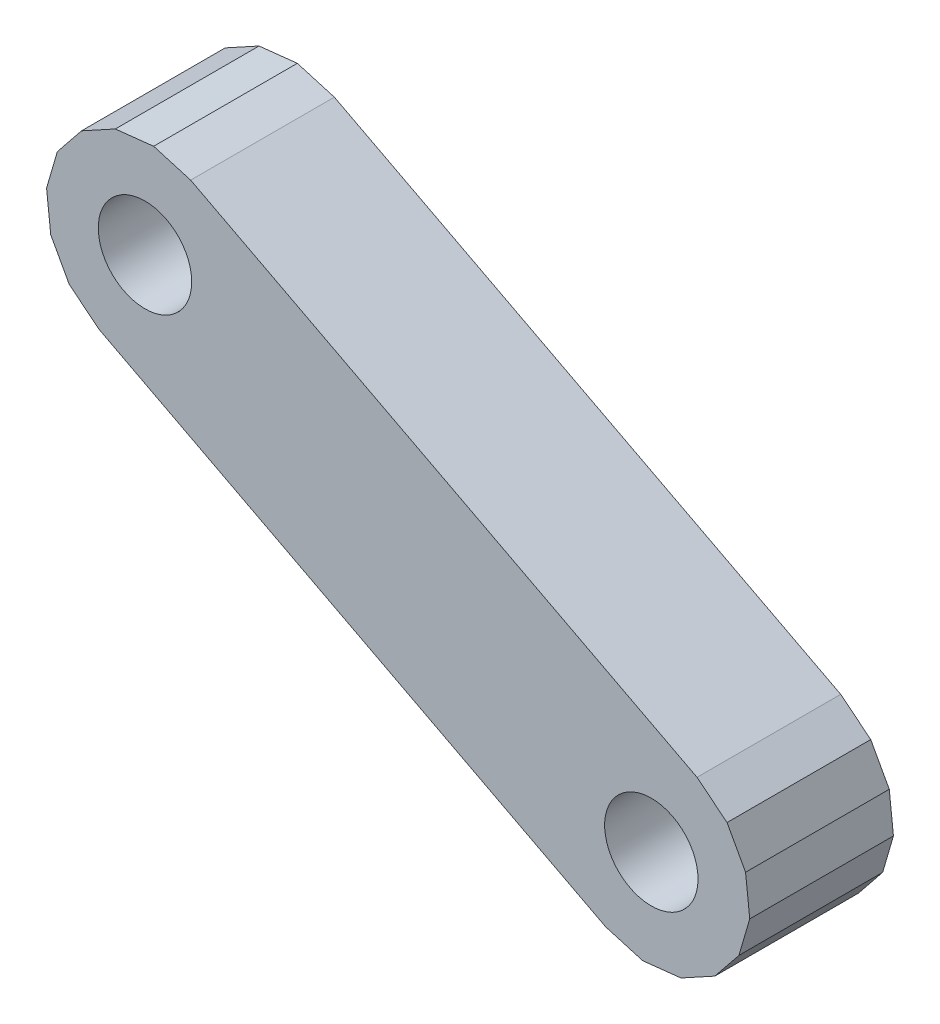
ISO-10303-21;
HEADER;
FILE_DESCRIPTION(('STEP AP214'),'2;1');
FILE_NAME('part.step','',(''),(''),'','','');
FILE_SCHEMA(('AUTOMOTIVE_DESIGN { 1 0 10303 214 1 1 1 1 }'));
ENDSEC;
DATA;
#1=APPLICATION_CONTEXT('core data for automotive mechanical design processes');
#2=APPLICATION_PROTOCOL_DEFINITION('international standard','automotive_design',2000,#1);
#3=PRODUCT_CONTEXT('',#1,'mechanical');
#4=PRODUCT('Part','Part','',(#3));
#5=PRODUCT_RELATED_PRODUCT_CATEGORY('part','',(#4));
#6=PRODUCT_DEFINITION_FORMATION('','',#4);
#7=PRODUCT_DEFINITION_CONTEXT('part definition',#1,'design');
#8=PRODUCT_DEFINITION('design','',#6,#7);
#9=PRODUCT_DEFINITION_SHAPE('','',#8);
#10=(LENGTH_UNIT() NAMED_UNIT(*) SI_UNIT(.MILLI.,.METRE.));
#11=(NAMED_UNIT(*) PLANE_ANGLE_UNIT() SI_UNIT($,.RADIAN.));
#12=(NAMED_UNIT(*) SI_UNIT($,.STERADIAN.) SOLID_ANGLE_UNIT());
#13=UNCERTAINTY_MEASURE_WITH_UNIT(LENGTH_MEASURE(1.E-05),#10,'distance_accuracy_value','');
#14=(GEOMETRIC_REPRESENTATION_CONTEXT(3) GLOBAL_UNCERTAINTY_ASSIGNED_CONTEXT((#13)) GLOBAL_UNIT_ASSIGNED_CONTEXT((#10,
#11,#12)) REPRESENTATION_CONTEXT('',''));
#15=CARTESIAN_POINT('',(0.,0.,0.));
#16=DIRECTION('',(0.,0.,1.));
#17=DIRECTION('',(1.,0.,0.));
#18=AXIS2_PLACEMENT_3D('',#15,#16,#17);
#19=CARTESIAN_POINT('',(-15.5425925457675,21.1229903479481,8.));
#20=DIRECTION('',(0.462289553775913,0.886729027645801,0.));
#21=DIRECTION('',(-0.886729027645801,0.462289553775913,0.));
#22=AXIS2_PLACEMENT_3D('',#19,#20,#21);
#23=PLANE('',#22);
#24=DIRECTION('',(0.886729027645801,-0.462289553775912,0.));
#25=VECTOR('',#24,1.);
#26=CARTESIAN_POINT('',(-15.5425925457675,21.1229903479481,0.));
#27=LINE('',#26,#25);
#28=CARTESIAN_POINT('',(-43.7332020858087,35.8199540185028,0.));
#29=VERTEX_POINT('',#28);
#30=CARTESIAN_POINT('',(-15.5425925457675,21.1229903479481,0.));
#31=VERTEX_POINT('',#30);
#32=EDGE_CURVE('E195',#29,#31,#27,.T.);
#33=ORIENTED_EDGE('',*,*,#32,.T.);
#34=DIRECTION('',(0.,0.,-1.));
#35=VECTOR('',#34,1.);
#36=CARTESIAN_POINT('',(-15.5425925457675,21.1229903479481,8.));
#37=LINE('',#36,#35);
#38=CARTESIAN_POINT('',(-15.5425925457675,21.1229903479481,8.));
#39=VERTEX_POINT('',#38);
#40=EDGE_CURVE('E11',#39,#31,#37,.T.);
#41=ORIENTED_EDGE('',*,*,#40,.F.);
#42=DIRECTION('',(0.886729027645801,-0.462289553775912,0.));
#43=VECTOR('',#42,1.);
#44=CARTESIAN_POINT('',(-15.5425925457675,21.1229903479481,8.));
#45=LINE('',#44,#43);
#46=CARTESIAN_POINT('',(-43.7332020858087,35.8199540185028,8.));
#47=VERTEX_POINT('',#46);
#48=EDGE_CURVE('E230',#47,#39,#45,.T.);
#49=ORIENTED_EDGE('',*,*,#48,.F.);
#50=DIRECTION('',(0.,0.,-1.));
#51=VECTOR('',#50,1.);
#52=CARTESIAN_POINT('',(-43.7332020858087,35.8199540185028,8.));
#53=LINE('',#52,#51);
#54=EDGE_CURVE('E191',#47,#29,#53,.T.);
#55=ORIENTED_EDGE('',*,*,#54,.T.);
#56=EDGE_LOOP('',(#33,#41,#49,#55));
#57=FACE_BOUND('',#56,.T.);
#58=ADVANCED_FACE('F39',(#57),#23,.F.);
#59=CARTESIAN_POINT('',(-13.4826984192255,20.521222560089,8.));
#60=DIRECTION('',(0.280414538083123,0.959878995932106,0.));
#61=DIRECTION('',(-0.959878995932106,0.280414538083123,0.));
#62=AXIS2_PLACEMENT_3D('',#59,#60,#61);
#63=PLANE('',#62);
#64=DIRECTION('',(0.959878995932106,-0.280414538083123,0.));
#65=VECTOR('',#64,1.);
#66=CARTESIAN_POINT('',(-13.4826984192255,20.521222560089,0.));
#67=LINE('',#66,#65);
#68=CARTESIAN_POINT('',(-13.4826984192255,20.521222560089,0.));
#69=VERTEX_POINT('',#68);
#70=EDGE_CURVE('E198',#31,#69,#67,.T.);
#71=ORIENTED_EDGE('',*,*,#70,.T.);
#72=DIRECTION('',(0.,0.,-1.));
#73=VECTOR('',#72,1.);
#74=CARTESIAN_POINT('',(-13.4826984192255,20.521222560089,8.));
#75=LINE('',#74,#73);
#76=CARTESIAN_POINT('',(-13.4826984192255,20.521222560089,8.));
#77=VERTEX_POINT('',#76);
#78=EDGE_CURVE('E47',#77,#69,#75,.T.);
#79=ORIENTED_EDGE('',*,*,#78,.F.);
#80=DIRECTION('',(0.959878995932106,-0.280414538083123,0.));
#81=VECTOR('',#80,1.);
#82=CARTESIAN_POINT('',(-13.4826984192255,20.521222560089,8.));
#83=LINE('',#82,#81);
#84=EDGE_CURVE('E128',#39,#77,#83,.T.);
#85=ORIENTED_EDGE('',*,*,#84,.F.);
#86=ORIENTED_EDGE('',*,*,#40,.T.);
#87=EDGE_LOOP('',(#71,#79,#85,#86));
#88=FACE_BOUND('',#87,.T.);
#89=ADVANCED_FACE('F339',(#88),#63,.F.);
#90=CARTESIAN_POINT('',(-11.3493178340284,20.7535489722153,8.));
#91=DIRECTION('',(-0.108260536464848,0.994122555947879,0.));
#92=DIRECTION('',(-0.994122555947879,-0.108260536464848,0.));
#93=AXIS2_PLACEMENT_3D('',#90,#91,#92);
#94=PLANE('',#93);
#95=DIRECTION('',(0.994122555947879,0.108260536464848,0.));
#96=VECTOR('',#95,1.);
#97=CARTESIAN_POINT('',(-11.3493178340284,20.7535489722153,0.));
#98=LINE('',#97,#96);
#99=CARTESIAN_POINT('',(-11.3493178340284,20.7535489722153,0.));
#100=VERTEX_POINT('',#99);
#101=EDGE_CURVE('E201',#69,#100,#98,.T.);
#102=ORIENTED_EDGE('',*,*,#101,.T.);
#103=DIRECTION('',(0.,0.,-1.));
#104=VECTOR('',#103,1.);
#105=CARTESIAN_POINT('',(-11.3493178340284,20.7535489722153,8.));
#106=LINE('',#105,#104);
#107=CARTESIAN_POINT('',(-11.3493178340284,20.7535489722153,8.));
#108=VERTEX_POINT('',#107);
#109=EDGE_CURVE('E267',#108,#100,#106,.T.);
#110=ORIENTED_EDGE('',*,*,#109,.F.);
#111=DIRECTION('',(0.994122555947879,0.108260536464848,0.));
#112=VECTOR('',#111,1.);
#113=CARTESIAN_POINT('',(-11.3493178340284,20.7535489722153,8.));
#114=LINE('',#113,#112);
#115=EDGE_CURVE('E275',#77,#108,#114,.T.);
#116=ORIENTED_EDGE('',*,*,#115,.F.);
#117=ORIENTED_EDGE('',*,*,#78,.T.);
#118=EDGE_LOOP('',(#102,#110,#116,#117));
#119=FACE_BOUND('',#118,.T.);
#120=ADVANCED_FACE('F273',(#119),#94,.F.);
#121=CARTESIAN_POINT('',(-9.46723864512946,21.7845999941247,8.));
#122=DIRECTION('',(-0.480453925720257,0.877019968563997,0.));
#123=DIRECTION('',(-0.877019968563997,-0.480453925720257,0.));
#124=AXIS2_PLACEMENT_3D('',#121,#122,#123);
#125=PLANE('',#124);
#126=DIRECTION('',(0.877019968563997,0.480453925720257,0.));
#127=VECTOR('',#126,1.);
#128=CARTESIAN_POINT('',(-9.46723864512946,21.7845999941247,0.));
#129=LINE('',#128,#127);
#130=CARTESIAN_POINT('',(-9.46723864512946,21.7845999941247,0.));
#131=VERTEX_POINT('',#130);
#132=EDGE_CURVE('E203',#100,#131,#129,.T.);
#133=ORIENTED_EDGE('',*,*,#132,.T.);
#134=DIRECTION('',(0.,0.,-1.));
#135=VECTOR('',#134,1.);
#136=CARTESIAN_POINT('',(-9.46723864512946,21.7845999941247,8.));
#137=LINE('',#136,#135);
#138=CARTESIAN_POINT('',(-9.46723864512946,21.7845999941247,8.));
#139=VERTEX_POINT('',#138);
#140=EDGE_CURVE('E264',#139,#131,#137,.T.);
#141=ORIENTED_EDGE('',*,*,#140,.F.);
#142=DIRECTION('',(0.877019968563997,0.480453925720257,0.));
#143=VECTOR('',#142,1.);
#144=CARTESIAN_POINT('',(-9.46723864512946,21.7845999941247,8.));
#145=LINE('',#144,#143);
#146=EDGE_CURVE('E293',#108,#139,#145,.T.);
#147=ORIENTED_EDGE('',*,*,#146,.F.);
#148=ORIENTED_EDGE('',*,*,#109,.T.);
#149=EDGE_LOOP('',(#133,#141,#147,#148));
#150=FACE_BOUND('',#149,.T.);
#151=ADVANCED_FACE('F284',(#150),#125,.F.);
#152=CARTESIAN_POINT('',(-8.12299034794809,23.4574074542325,8.));
#153=DIRECTION('',(-0.779502560110436,0.62639904117206,0.));
#154=DIRECTION('',(-0.62639904117206,-0.779502560110436,0.));
#155=AXIS2_PLACEMENT_3D('',#152,#153,#154);
#156=PLANE('',#155);
#157=DIRECTION('',(0.62639904117206,0.779502560110436,0.));
#158=VECTOR('',#157,1.);
#159=CARTESIAN_POINT('',(-8.12299034794809,23.4574074542325,0.));
#160=LINE('',#159,#158);
#161=CARTESIAN_POINT('',(-8.12299034794809,23.4574074542325,0.));
#162=VERTEX_POINT('',#161);
#163=EDGE_CURVE('E205',#131,#162,#160,.T.);
#164=ORIENTED_EDGE('',*,*,#163,.T.);
#165=DIRECTION('',(0.,0.,-1.));
#166=VECTOR('',#165,1.);
#167=CARTESIAN_POINT('',(-8.12299034794809,23.4574074542325,8.));
#168=LINE('',#167,#166);
#169=CARTESIAN_POINT('',(-8.12299034794809,23.4574074542325,8.));
#170=VERTEX_POINT('',#169);
#171=EDGE_CURVE('E261',#170,#162,#168,.T.);
#172=ORIENTED_EDGE('',*,*,#171,.F.);
#173=DIRECTION('',(0.62639904117206,0.779502560110436,0.));
#174=VECTOR('',#173,1.);
#175=CARTESIAN_POINT('',(-8.12299034794809,23.4574074542325,8.));
#176=LINE('',#175,#174);
#177=EDGE_CURVE('E290',#139,#170,#176,.T.);
#178=ORIENTED_EDGE('',*,*,#177,.F.);
#179=ORIENTED_EDGE('',*,*,#140,.T.);
#180=EDGE_LOOP('',(#164,#172,#178,#179));
#181=FACE_BOUND('',#180,.T.);
#182=ADVANCED_FACE('F288',(#181),#156,.F.);
#183=CARTESIAN_POINT('',(-7.52122256008905,25.5173015807745,8.));
#184=DIRECTION('',(-0.959878995932106,0.280414538083125,0.));
#185=DIRECTION('',(-0.280414538083125,-0.959878995932106,0.));
#186=AXIS2_PLACEMENT_3D('',#183,#184,#185);
#187=PLANE('',#186);
#188=DIRECTION('',(0.280414538083125,0.959878995932106,0.));
#189=VECTOR('',#188,1.);
#190=CARTESIAN_POINT('',(-7.52122256008905,25.5173015807745,0.));
#191=LINE('',#190,#189);
#192=CARTESIAN_POINT('',(-7.52122256008905,25.5173015807745,0.));
#193=VERTEX_POINT('',#192);
#194=EDGE_CURVE('E207',#162,#193,#191,.T.);
#195=ORIENTED_EDGE('',*,*,#194,.T.);
#196=DIRECTION('',(0.,0.,-1.));
#197=VECTOR('',#196,1.);
#198=CARTESIAN_POINT('',(-7.52122256008905,25.5173015807745,8.));
#199=LINE('',#198,#197);
#200=CARTESIAN_POINT('',(-7.52122256008905,25.5173015807745,8.));
#201=VERTEX_POINT('',#200);
#202=EDGE_CURVE('E258',#201,#193,#199,.T.);
#203=ORIENTED_EDGE('',*,*,#202,.F.);
#204=DIRECTION('',(0.280414538083125,0.959878995932106,0.));
#205=VECTOR('',#204,1.);
#206=CARTESIAN_POINT('',(-7.52122256008905,25.5173015807745,8.));
#207=LINE('',#206,#205);
#208=EDGE_CURVE('E292',#170,#201,#207,.T.);
#209=ORIENTED_EDGE('',*,*,#208,.F.);
#210=ORIENTED_EDGE('',*,*,#171,.T.);
#211=EDGE_LOOP('',(#195,#203,#209,#210));
#212=FACE_BOUND('',#211,.T.);
#213=ADVANCED_FACE('F352',(#212),#187,.F.);
#214=CARTESIAN_POINT('',(-7.75354897221527,27.6506821659716,8.));
#215=DIRECTION('',(-0.994122555947879,-0.108260536464849,0.));
#216=DIRECTION('',(0.108260536464849,-0.994122555947879,0.));
#217=AXIS2_PLACEMENT_3D('',#214,#215,#216);
#218=PLANE('',#217);
#219=DIRECTION('',(-0.108260536464849,0.994122555947878,0.));
#220=VECTOR('',#219,1.);
#221=CARTESIAN_POINT('',(-7.75354897221527,27.6506821659716,0.));
#222=LINE('',#221,#220);
#223=CARTESIAN_POINT('',(-7.75354897221527,27.6506821659716,0.));
#224=VERTEX_POINT('',#223);
#225=EDGE_CURVE('E209',#193,#224,#222,.T.);
#226=ORIENTED_EDGE('',*,*,#225,.T.);
#227=DIRECTION('',(0.,0.,-1.));
#228=VECTOR('',#227,1.);
#229=CARTESIAN_POINT('',(-7.75354897221527,27.6506821659716,8.));
#230=LINE('',#229,#228);
#231=CARTESIAN_POINT('',(-7.75354897221527,27.6506821659716,8.));
#232=VERTEX_POINT('',#231);
#233=EDGE_CURVE('E255',#232,#224,#230,.T.);
#234=ORIENTED_EDGE('',*,*,#233,.F.);
#235=DIRECTION('',(-0.108260536464849,0.994122555947878,0.));
#236=VECTOR('',#235,1.);
#237=CARTESIAN_POINT('',(-7.75354897221527,27.6506821659716,8.));
#238=LINE('',#237,#236);
#239=EDGE_CURVE('E295',#201,#232,#238,.T.);
#240=ORIENTED_EDGE('',*,*,#239,.F.);
#241=ORIENTED_EDGE('',*,*,#202,.T.);
#242=EDGE_LOOP('',(#226,#234,#240,#241));
#243=FACE_BOUND('',#242,.T.);
#244=ADVANCED_FACE('F355',(#243),#218,.F.);
#245=CARTESIAN_POINT('',(-8.78459999412473,29.5327613548705,8.));
#246=DIRECTION('',(-0.877019968563997,-0.480453925720256,0.));
#247=DIRECTION('',(0.480453925720256,-0.877019968563997,0.));
#248=AXIS2_PLACEMENT_3D('',#245,#246,#247);
#249=PLANE('',#248);
#250=DIRECTION('',(-0.480453925720256,0.877019968563997,0.));
#251=VECTOR('',#250,1.);
#252=CARTESIAN_POINT('',(-8.78459999412473,29.5327613548705,0.));
#253=LINE('',#252,#251);
#254=CARTESIAN_POINT('',(-8.78459999412473,29.5327613548705,0.));
#255=VERTEX_POINT('',#254);
#256=EDGE_CURVE('E211',#224,#255,#253,.T.);
#257=ORIENTED_EDGE('',*,*,#256,.T.);
#258=DIRECTION('',(0.,0.,-1.));
#259=VECTOR('',#258,1.);
#260=CARTESIAN_POINT('',(-8.78459999412473,29.5327613548705,8.));
#261=LINE('',#260,#259);
#262=CARTESIAN_POINT('',(-8.78459999412473,29.5327613548705,8.));
#263=VERTEX_POINT('',#262);
#264=EDGE_CURVE('E252',#263,#255,#261,.T.);
#265=ORIENTED_EDGE('',*,*,#264,.F.);
#266=DIRECTION('',(-0.480453925720256,0.877019968563997,0.));
#267=VECTOR('',#266,1.);
#268=CARTESIAN_POINT('',(-8.78459999412473,29.5327613548705,8.));
#269=LINE('',#268,#267);
#270=EDGE_CURVE('E301',#232,#263,#269,.T.);
#271=ORIENTED_EDGE('',*,*,#270,.F.);
#272=ORIENTED_EDGE('',*,*,#233,.T.);
#273=EDGE_LOOP('',(#257,#265,#271,#272));
#274=FACE_BOUND('',#273,.T.);
#275=ADVANCED_FACE('F359',(#274),#249,.F.);
#276=CARTESIAN_POINT('',(-10.4574074542325,30.8770096520519,8.));
#277=DIRECTION('',(-0.62639904117206,-0.779502560110436,0.));
#278=DIRECTION('',(0.779502560110436,-0.62639904117206,0.));
#279=AXIS2_PLACEMENT_3D('',#276,#277,#278);
#280=PLANE('',#279);
#281=DIRECTION('',(-0.779502560110436,0.62639904117206,0.));
#282=VECTOR('',#281,1.);
#283=CARTESIAN_POINT('',(-10.4574074542325,30.8770096520519,0.));
#284=LINE('',#283,#282);
#285=CARTESIAN_POINT('',(-10.4574074542325,30.8770096520519,0.));
#286=VERTEX_POINT('',#285);
#287=EDGE_CURVE('E213',#255,#286,#284,.T.);
#288=ORIENTED_EDGE('',*,*,#287,.T.);
#289=DIRECTION('',(0.,0.,-1.));
#290=VECTOR('',#289,1.);
#291=CARTESIAN_POINT('',(-10.4574074542325,30.8770096520519,8.));
#292=LINE('',#291,#290);
#293=CARTESIAN_POINT('',(-10.4574074542325,30.8770096520519,8.));
#294=VERTEX_POINT('',#293);
#295=EDGE_CURVE('E249',#294,#286,#292,.T.);
#296=ORIENTED_EDGE('',*,*,#295,.F.);
#297=DIRECTION('',(-0.779502560110436,0.62639904117206,0.));
#298=VECTOR('',#297,1.);
#299=CARTESIAN_POINT('',(-10.4574074542325,30.8770096520519,8.));
#300=LINE('',#299,#298);
#301=EDGE_CURVE('E303',#263,#294,#300,.T.);
#302=ORIENTED_EDGE('',*,*,#301,.F.);
#303=ORIENTED_EDGE('',*,*,#264,.T.);
#304=EDGE_LOOP('',(#288,#296,#302,#303));
#305=FACE_BOUND('',#304,.T.);
#306=ADVANCED_FACE('F363',(#305),#280,.F.);
#307=CARTESIAN_POINT('',(-38.6480169942737,45.5739733226066,8.));
#308=DIRECTION('',(-0.462289553775912,-0.886729027645801,0.));
#309=DIRECTION('',(0.886729027645801,-0.462289553775912,0.));
#310=AXIS2_PLACEMENT_3D('',#307,#308,#309);
#311=PLANE('',#310);
#312=DIRECTION('',(-0.886729027645801,0.462289553775912,0.));
#313=VECTOR('',#312,1.);
#314=CARTESIAN_POINT('',(-38.6480169942737,45.5739733226066,0.));
#315=LINE('',#314,#313);
#316=CARTESIAN_POINT('',(-38.6480169942737,45.5739733226066,0.));
#317=VERTEX_POINT('',#316);
#318=EDGE_CURVE('E215',#286,#317,#315,.T.);
#319=ORIENTED_EDGE('',*,*,#318,.T.);
#320=DIRECTION('',(0.,0.,-1.));
#321=VECTOR('',#320,1.);
#322=CARTESIAN_POINT('',(-38.6480169942737,45.5739733226066,8.));
#323=LINE('',#322,#321);
#324=CARTESIAN_POINT('',(-38.6480169942737,45.5739733226066,8.));
#325=VERTEX_POINT('',#324);
#326=EDGE_CURVE('E246',#325,#317,#323,.T.);
#327=ORIENTED_EDGE('',*,*,#326,.F.);
#328=DIRECTION('',(-0.886729027645801,0.462289553775912,0.));
#329=VECTOR('',#328,1.);
#330=CARTESIAN_POINT('',(-38.6480169942737,45.5739733226066,8.));
#331=LINE('',#330,#329);
#332=EDGE_CURVE('E305',#294,#325,#331,.T.);
#333=ORIENTED_EDGE('',*,*,#332,.F.);
#334=ORIENTED_EDGE('',*,*,#295,.T.);
#335=EDGE_LOOP('',(#319,#327,#333,#334));
#336=FACE_BOUND('',#335,.T.);
#337=ADVANCED_FACE('F367',(#336),#311,.F.);
#338=CARTESIAN_POINT('',(-40.7079111208157,46.1757411104657,8.));
#339=DIRECTION('',(-0.280414538083126,-0.959878995932105,0.));
#340=DIRECTION('',(0.959878995932105,-0.280414538083126,0.));
#341=AXIS2_PLACEMENT_3D('',#338,#339,#340);
#342=PLANE('',#341);
#343=DIRECTION('',(-0.959878995932105,0.280414538083126,0.));
#344=VECTOR('',#343,1.);
#345=CARTESIAN_POINT('',(-40.7079111208157,46.1757411104657,0.));
#346=LINE('',#345,#344);
#347=CARTESIAN_POINT('',(-40.7079111208157,46.1757411104657,0.));
#348=VERTEX_POINT('',#347);
#349=EDGE_CURVE('E217',#317,#348,#346,.T.);
#350=ORIENTED_EDGE('',*,*,#349,.T.);
#351=DIRECTION('',(0.,0.,-1.));
#352=VECTOR('',#351,1.);
#353=CARTESIAN_POINT('',(-40.7079111208157,46.1757411104657,8.));
#354=LINE('',#353,#352);
#355=CARTESIAN_POINT('',(-40.7079111208157,46.1757411104657,8.));
#356=VERTEX_POINT('',#355);
#357=EDGE_CURVE('E243',#356,#348,#354,.T.);
#358=ORIENTED_EDGE('',*,*,#357,.F.);
#359=DIRECTION('',(-0.959878995932105,0.280414538083126,0.));
#360=VECTOR('',#359,1.);
#361=CARTESIAN_POINT('',(-40.7079111208157,46.1757411104657,8.));
#362=LINE('',#361,#360);
#363=EDGE_CURVE('E307',#325,#356,#362,.T.);
#364=ORIENTED_EDGE('',*,*,#363,.F.);
#365=ORIENTED_EDGE('',*,*,#326,.T.);
#366=EDGE_LOOP('',(#350,#358,#364,#365));
#367=FACE_BOUND('',#366,.T.);
#368=ADVANCED_FACE('F371',(#367),#342,.F.);
#369=CARTESIAN_POINT('',(-42.8412917060128,45.9434146983394,8.));
#370=DIRECTION('',(0.108260536464849,-0.994122555947879,0.));
#371=DIRECTION('',(0.994122555947879,0.108260536464849,0.));
#372=AXIS2_PLACEMENT_3D('',#369,#370,#371);
#373=PLANE('',#372);
#374=DIRECTION('',(-0.994122555947879,-0.108260536464849,0.));
#375=VECTOR('',#374,1.);
#376=CARTESIAN_POINT('',(-42.8412917060128,45.9434146983394,0.));
#377=LINE('',#376,#375);
#378=CARTESIAN_POINT('',(-42.8412917060128,45.9434146983394,0.));
#379=VERTEX_POINT('',#378);
#380=EDGE_CURVE('E219',#348,#379,#377,.T.);
#381=ORIENTED_EDGE('',*,*,#380,.T.);
#382=DIRECTION('',(0.,0.,-1.));
#383=VECTOR('',#382,1.);
#384=CARTESIAN_POINT('',(-42.8412917060128,45.9434146983394,8.));
#385=LINE('',#384,#383);
#386=CARTESIAN_POINT('',(-42.8412917060128,45.9434146983394,8.));
#387=VERTEX_POINT('',#386);
#388=EDGE_CURVE('E240',#387,#379,#385,.T.);
#389=ORIENTED_EDGE('',*,*,#388,.F.);
#390=DIRECTION('',(-0.994122555947879,-0.108260536464849,0.));
#391=VECTOR('',#390,1.);
#392=CARTESIAN_POINT('',(-42.8412917060128,45.9434146983394,8.));
#393=LINE('',#392,#391);
#394=EDGE_CURVE('E309',#356,#387,#393,.T.);
#395=ORIENTED_EDGE('',*,*,#394,.F.);
#396=ORIENTED_EDGE('',*,*,#357,.T.);
#397=EDGE_LOOP('',(#381,#389,#395,#396));
#398=FACE_BOUND('',#397,.T.);
#399=ADVANCED_FACE('F375',(#398),#373,.F.);
#400=CARTESIAN_POINT('',(-44.7233708949118,44.91236367643,8.));
#401=DIRECTION('',(0.480453925720253,-0.877019968563999,0.));
#402=DIRECTION('',(0.877019968563999,0.480453925720253,0.));
#403=AXIS2_PLACEMENT_3D('',#400,#401,#402);
#404=PLANE('',#403);
#405=DIRECTION('',(-0.877019968563999,-0.480453925720253,0.));
#406=VECTOR('',#405,1.);
#407=CARTESIAN_POINT('',(-44.7233708949118,44.91236367643,0.));
#408=LINE('',#407,#406);
#409=CARTESIAN_POINT('',(-44.7233708949118,44.91236367643,0.));
#410=VERTEX_POINT('',#409);
#411=EDGE_CURVE('E221',#379,#410,#408,.T.);
#412=ORIENTED_EDGE('',*,*,#411,.T.);
#413=DIRECTION('',(0.,0.,-1.));
#414=VECTOR('',#413,1.);
#415=CARTESIAN_POINT('',(-44.7233708949118,44.91236367643,8.));
#416=LINE('',#415,#414);
#417=CARTESIAN_POINT('',(-44.7233708949118,44.91236367643,8.));
#418=VERTEX_POINT('',#417);
#419=EDGE_CURVE('E237',#418,#410,#416,.T.);
#420=ORIENTED_EDGE('',*,*,#419,.F.);
#421=DIRECTION('',(-0.877019968563999,-0.480453925720253,0.));
#422=VECTOR('',#421,1.);
#423=CARTESIAN_POINT('',(-44.7233708949118,44.91236367643,8.));
#424=LINE('',#423,#422);
#425=EDGE_CURVE('E311',#387,#418,#424,.T.);
#426=ORIENTED_EDGE('',*,*,#425,.F.);
#427=ORIENTED_EDGE('',*,*,#388,.T.);
#428=EDGE_LOOP('',(#412,#420,#426,#427));
#429=FACE_BOUND('',#428,.T.);
#430=ADVANCED_FACE('F379',(#429),#404,.F.);
#431=CARTESIAN_POINT('',(-46.0676191920931,43.2395562163222,8.));
#432=DIRECTION('',(0.779502560110438,-0.626399041172058,0.));
#433=DIRECTION('',(0.626399041172058,0.779502560110438,0.));
#434=AXIS2_PLACEMENT_3D('',#431,#432,#433);
#435=PLANE('',#434);
#436=DIRECTION('',(-0.626399041172058,-0.779502560110438,0.));
#437=VECTOR('',#436,1.);
#438=CARTESIAN_POINT('',(-46.0676191920931,43.2395562163222,0.));
#439=LINE('',#438,#437);
#440=CARTESIAN_POINT('',(-46.0676191920931,43.2395562163222,0.));
#441=VERTEX_POINT('',#440);
#442=EDGE_CURVE('E223',#410,#441,#439,.T.);
#443=ORIENTED_EDGE('',*,*,#442,.T.);
#444=DIRECTION('',(0.,0.,-1.));
#445=VECTOR('',#444,1.);
#446=CARTESIAN_POINT('',(-46.0676191920931,43.2395562163222,8.));
#447=LINE('',#446,#445);
#448=CARTESIAN_POINT('',(-46.0676191920931,43.2395562163222,8.));
#449=VERTEX_POINT('',#448);
#450=EDGE_CURVE('E234',#449,#441,#447,.T.);
#451=ORIENTED_EDGE('',*,*,#450,.F.);
#452=DIRECTION('',(-0.626399041172058,-0.779502560110438,0.));
#453=VECTOR('',#452,1.);
#454=CARTESIAN_POINT('',(-46.0676191920931,43.2395562163222,8.));
#455=LINE('',#454,#453);
#456=EDGE_CURVE('E313',#418,#449,#455,.T.);
#457=ORIENTED_EDGE('',*,*,#456,.F.);
#458=ORIENTED_EDGE('',*,*,#419,.T.);
#459=EDGE_LOOP('',(#443,#451,#457,#458));
#460=FACE_BOUND('',#459,.T.);
#461=ADVANCED_FACE('F319',(#460),#435,.F.);
#462=CARTESIAN_POINT('',(-46.6693869799522,41.1796620897802,8.));
#463=DIRECTION('',(0.959878995932105,-0.280414538083129,0.));
#464=DIRECTION('',(0.280414538083129,0.959878995932105,0.));
#465=AXIS2_PLACEMENT_3D('',#462,#463,#464);
#466=PLANE('',#465);
#467=DIRECTION('',(-0.280414538083129,-0.959878995932105,0.));
#468=VECTOR('',#467,1.);
#469=CARTESIAN_POINT('',(-46.6693869799522,41.1796620897802,0.));
#470=LINE('',#469,#468);
#471=CARTESIAN_POINT('',(-46.6693869799522,41.1796620897802,0.));
#472=VERTEX_POINT('',#471);
#473=EDGE_CURVE('E225',#441,#472,#470,.T.);
#474=ORIENTED_EDGE('',*,*,#473,.T.);
#475=DIRECTION('',(0.,0.,-1.));
#476=VECTOR('',#475,1.);
#477=CARTESIAN_POINT('',(-46.6693869799522,41.1796620897802,8.));
#478=LINE('',#477,#476);
#479=CARTESIAN_POINT('',(-46.6693869799522,41.1796620897802,8.));
#480=VERTEX_POINT('',#479);
#481=EDGE_CURVE('E186',#480,#472,#478,.T.);
#482=ORIENTED_EDGE('',*,*,#481,.F.);
#483=DIRECTION('',(-0.280414538083129,-0.959878995932105,0.));
#484=VECTOR('',#483,1.);
#485=CARTESIAN_POINT('',(-46.6693869799522,41.1796620897802,8.));
#486=LINE('',#485,#484);
#487=EDGE_CURVE('E177',#449,#480,#486,.T.);
#488=ORIENTED_EDGE('',*,*,#487,.F.);
#489=ORIENTED_EDGE('',*,*,#450,.T.);
#490=EDGE_LOOP('',(#474,#482,#488,#489));
#491=FACE_BOUND('',#490,.T.);
#492=ADVANCED_FACE('F323',(#491),#466,.F.);
#493=CARTESIAN_POINT('',(-46.4370605678259,39.0462815045831,8.));
#494=DIRECTION('',(0.994122555947879,0.108260536464849,0.));
#495=DIRECTION('',(-0.108260536464849,0.994122555947879,0.));
#496=AXIS2_PLACEMENT_3D('',#493,#494,#495);
#497=PLANE('',#496);
#498=DIRECTION('',(0.108260536464849,-0.994122555947878,0.));
#499=VECTOR('',#498,1.);
#500=CARTESIAN_POINT('',(-46.4370605678259,39.0462815045831,0.));
#501=LINE('',#500,#499);
#502=CARTESIAN_POINT('',(-46.4370605678259,39.0462815045831,0.));
#503=VERTEX_POINT('',#502);
#504=EDGE_CURVE('E185',#472,#503,#501,.T.);
#505=ORIENTED_EDGE('',*,*,#504,.T.);
#506=DIRECTION('',(0.,0.,-1.));
#507=VECTOR('',#506,1.);
#508=CARTESIAN_POINT('',(-46.4370605678259,39.0462815045831,8.));
#509=LINE('',#508,#507);
#510=CARTESIAN_POINT('',(-46.4370605678259,39.0462815045831,8.));
#511=VERTEX_POINT('',#510);
#512=EDGE_CURVE('E182',#511,#503,#509,.T.);
#513=ORIENTED_EDGE('',*,*,#512,.F.);
#514=DIRECTION('',(0.108260536464849,-0.994122555947878,0.));
#515=VECTOR('',#514,1.);
#516=CARTESIAN_POINT('',(-46.4370605678259,39.0462815045831,8.));
#517=LINE('',#516,#515);
#518=EDGE_CURVE('E171',#480,#511,#517,.T.);
#519=ORIENTED_EDGE('',*,*,#518,.F.);
#520=ORIENTED_EDGE('',*,*,#481,.T.);
#521=EDGE_LOOP('',(#505,#513,#519,#520));
#522=FACE_BOUND('',#521,.T.);
#523=ADVANCED_FACE('F183',(#522),#497,.F.);
#524=CARTESIAN_POINT('',(-45.4060095459165,37.1642023156842,8.));
#525=DIRECTION('',(0.877019968563997,0.480453925720257,0.));
#526=DIRECTION('',(-0.480453925720257,0.877019968563997,0.));
#527=AXIS2_PLACEMENT_3D('',#524,#525,#526);
#528=PLANE('',#527);
#529=DIRECTION('',(0.480453925720257,-0.877019968563996,0.));
#530=VECTOR('',#529,1.);
#531=CARTESIAN_POINT('',(-45.4060095459165,37.1642023156842,0.));
#532=LINE('',#531,#530);
#533=CARTESIAN_POINT('',(-45.4060095459165,37.1642023156842,0.));
#534=VERTEX_POINT('',#533);
#535=EDGE_CURVE('E114',#503,#534,#532,.T.);
#536=ORIENTED_EDGE('',*,*,#535,.T.);
#537=DIRECTION('',(0.,0.,-1.));
#538=VECTOR('',#537,1.);
#539=CARTESIAN_POINT('',(-45.4060095459165,37.1642023156842,8.));
#540=LINE('',#539,#538);
#541=CARTESIAN_POINT('',(-45.4060095459165,37.1642023156842,8.));
#542=VERTEX_POINT('',#541);
#543=EDGE_CURVE('E187',#542,#534,#540,.T.);
#544=ORIENTED_EDGE('',*,*,#543,.F.);
#545=DIRECTION('',(0.480453925720257,-0.877019968563996,0.));
#546=VECTOR('',#545,1.);
#547=CARTESIAN_POINT('',(-45.4060095459165,37.1642023156842,8.));
#548=LINE('',#547,#546);
#549=EDGE_CURVE('E175',#511,#542,#548,.T.);
#550=ORIENTED_EDGE('',*,*,#549,.F.);
#551=ORIENTED_EDGE('',*,*,#512,.T.);
#552=EDGE_LOOP('',(#536,#544,#550,#551));
#553=FACE_BOUND('',#552,.T.);
#554=ADVANCED_FACE('F189',(#553),#528,.F.);
#555=CARTESIAN_POINT('',(-43.7332020858087,35.8199540185028,8.));
#556=DIRECTION('',(0.62639904117206,0.779502560110436,0.));
#557=DIRECTION('',(-0.779502560110436,0.62639904117206,0.));
#558=AXIS2_PLACEMENT_3D('',#555,#556,#557);
#559=PLANE('',#558);
#560=DIRECTION('',(0.779502560110436,-0.62639904117206,0.));
#561=VECTOR('',#560,1.);
#562=CARTESIAN_POINT('',(-43.7332020858087,35.8199540185028,0.));
#563=LINE('',#562,#561);
#564=EDGE_CURVE('E120',#534,#29,#563,.T.);
#565=ORIENTED_EDGE('',*,*,#564,.T.);
#566=ORIENTED_EDGE('',*,*,#54,.F.);
#567=DIRECTION('',(0.779502560110436,-0.62639904117206,0.));
#568=VECTOR('',#567,1.);
#569=CARTESIAN_POINT('',(-43.7332020858087,35.8199540185028,8.));
#570=LINE('',#569,#568);
#571=EDGE_CURVE('E55',#542,#47,#570,.T.);
#572=ORIENTED_EDGE('',*,*,#571,.F.);
#573=ORIENTED_EDGE('',*,*,#543,.T.);
#574=EDGE_LOOP('',(#565,#566,#572,#573));
#575=FACE_BOUND('',#574,.T.);
#576=ADVANCED_FACE('F327',(#575),#559,.F.);
#577=CARTESIAN_POINT('',(0.,0.,8.));
#578=DIRECTION('',(0.,0.,-1.));
#579=DIRECTION('',(-1.,0.,0.));
#580=AXIS2_PLACEMENT_3D('',#577,#578,#579);
#581=PLANE('',#580);
#582=CARTESIAN_POINT('',(-13.,26.,8.));
#583=DIRECTION('',(0.,0.,1.));
#584=DIRECTION('',(1.,0.,0.));
#585=AXIS2_PLACEMENT_3D('',#582,#583,#584);
#586=CIRCLE('',#585,2.6);
#587=CARTESIAN_POINT('',(-10.4,26.,8.));
#588=VERTEX_POINT('',#587);
#589=EDGE_CURVE('E575',#588,#588,#586,.T.);
#590=ORIENTED_EDGE('',*,*,#589,.F.);
#591=EDGE_LOOP('',(#590));
#592=FACE_BOUND('',#591,.T.);
#593=CARTESIAN_POINT('',(-41.1906095400412,40.6969636705547,8.));
#594=DIRECTION('',(0.,0.,1.));
#595=DIRECTION('',(1.,0.,0.));
#596=AXIS2_PLACEMENT_3D('',#593,#594,#595);
#597=CIRCLE('',#596,2.6);
#598=CARTESIAN_POINT('',(-38.5906095400412,40.6969636705547,8.));
#599=VERTEX_POINT('',#598);
#600=EDGE_CURVE('E577',#599,#599,#597,.T.);
#601=ORIENTED_EDGE('',*,*,#600,.F.);
#602=EDGE_LOOP('',(#601));
#603=FACE_BOUND('',#602,.T.);
#604=ORIENTED_EDGE('',*,*,#48,.T.);
#605=ORIENTED_EDGE('',*,*,#84,.T.);
#606=ORIENTED_EDGE('',*,*,#115,.T.);
#607=ORIENTED_EDGE('',*,*,#146,.T.);
#608=ORIENTED_EDGE('',*,*,#177,.T.);
#609=ORIENTED_EDGE('',*,*,#208,.T.);
#610=ORIENTED_EDGE('',*,*,#239,.T.);
#611=ORIENTED_EDGE('',*,*,#270,.T.);
#612=ORIENTED_EDGE('',*,*,#301,.T.);
#613=ORIENTED_EDGE('',*,*,#332,.T.);
#614=ORIENTED_EDGE('',*,*,#363,.T.);
#615=ORIENTED_EDGE('',*,*,#394,.T.);
#616=ORIENTED_EDGE('',*,*,#425,.T.);
#617=ORIENTED_EDGE('',*,*,#456,.T.);
#618=ORIENTED_EDGE('',*,*,#487,.T.);
#619=ORIENTED_EDGE('',*,*,#518,.T.);
#620=ORIENTED_EDGE('',*,*,#549,.T.);
#621=ORIENTED_EDGE('',*,*,#571,.T.);
#622=EDGE_LOOP('',(#604,#605,#606,#607,#608,#609,#610,#611,#612,#613,#614,#615,#616,#617,#618,
#619,#620,#621));
#623=FACE_BOUND('',#622,.T.);
#624=ADVANCED_FACE('F173',(#592,#603,#623),#581,.F.);
#625=CARTESIAN_POINT('',(0.,0.,0.));
#626=DIRECTION('',(0.,0.,-1.));
#627=DIRECTION('',(-1.,0.,0.));
#628=AXIS2_PLACEMENT_3D('',#625,#626,#627);
#629=PLANE('',#628);
#630=CARTESIAN_POINT('',(-13.,26.,0.));
#631=DIRECTION('',(0.,0.,1.));
#632=DIRECTION('',(1.,0.,0.));
#633=AXIS2_PLACEMENT_3D('',#630,#631,#632);
#634=CIRCLE('',#633,2.6);
#635=CARTESIAN_POINT('',(-10.4,26.,0.));
#636=VERTEX_POINT('',#635);
#637=EDGE_CURVE('E572',#636,#636,#634,.T.);
#638=ORIENTED_EDGE('',*,*,#637,.T.);
#639=EDGE_LOOP('',(#638));
#640=FACE_BOUND('',#639,.T.);
#641=CARTESIAN_POINT('',(-41.1906095400412,40.6969636705547,0.));
#642=DIRECTION('',(0.,0.,1.));
#643=DIRECTION('',(1.,0.,0.));
#644=AXIS2_PLACEMENT_3D('',#641,#642,#643);
#645=CIRCLE('',#644,2.6);
#646=CARTESIAN_POINT('',(-38.5906095400412,40.6969636705547,0.));
#647=VERTEX_POINT('',#646);
#648=EDGE_CURVE('E199',#647,#647,#645,.T.);
#649=ORIENTED_EDGE('',*,*,#648,.T.);
#650=EDGE_LOOP('',(#649));
#651=FACE_BOUND('',#650,.T.);
#652=ORIENTED_EDGE('',*,*,#32,.F.);
#653=ORIENTED_EDGE('',*,*,#564,.F.);
#654=ORIENTED_EDGE('',*,*,#535,.F.);
#655=ORIENTED_EDGE('',*,*,#504,.F.);
#656=ORIENTED_EDGE('',*,*,#473,.F.);
#657=ORIENTED_EDGE('',*,*,#442,.F.);
#658=ORIENTED_EDGE('',*,*,#411,.F.);
#659=ORIENTED_EDGE('',*,*,#380,.F.);
#660=ORIENTED_EDGE('',*,*,#349,.F.);
#661=ORIENTED_EDGE('',*,*,#318,.F.);
#662=ORIENTED_EDGE('',*,*,#287,.F.);
#663=ORIENTED_EDGE('',*,*,#256,.F.);
#664=ORIENTED_EDGE('',*,*,#225,.F.);
#665=ORIENTED_EDGE('',*,*,#194,.F.);
#666=ORIENTED_EDGE('',*,*,#163,.F.);
#667=ORIENTED_EDGE('',*,*,#132,.F.);
#668=ORIENTED_EDGE('',*,*,#101,.F.);
#669=ORIENTED_EDGE('',*,*,#70,.F.);
#670=EDGE_LOOP('',(#652,#653,#654,#655,#656,#657,#658,#659,#660,#661,#662,#663,#664,#665,#666,
#667,#668,#669));
#671=FACE_BOUND('',#670,.T.);
#672=ADVANCED_FACE('F279',(#640,#651,#671),#629,.T.);
#673=CARTESIAN_POINT('',(-41.1906095400412,40.6969636705547,0.));
#674=DIRECTION('',(0.,0.,1.));
#675=DIRECTION('',(1.,0.,0.));
#676=AXIS2_PLACEMENT_3D('',#673,#674,#675);
#677=CYLINDRICAL_SURFACE('',#676,2.6);
#678=ORIENTED_EDGE('',*,*,#648,.F.);
#679=EDGE_LOOP('',(#678));
#680=FACE_BOUND('',#679,.T.);
#681=ORIENTED_EDGE('',*,*,#600,.T.);
#682=EDGE_LOOP('',(#681));
#683=FACE_BOUND('',#682,.T.);
#684=ADVANCED_FACE('F409',(#680,#683),#677,.F.);
#685=CARTESIAN_POINT('',(-13.,26.,0.));
#686=DIRECTION('',(0.,0.,1.));
#687=DIRECTION('',(1.,0.,0.));
#688=AXIS2_PLACEMENT_3D('',#685,#686,#687);
#689=CYLINDRICAL_SURFACE('',#688,2.6);
#690=ORIENTED_EDGE('',*,*,#637,.F.);
#691=EDGE_LOOP('',(#690));
#692=FACE_BOUND('',#691,.T.);
#693=ORIENTED_EDGE('',*,*,#589,.T.);
#694=EDGE_LOOP('',(#693));
#695=FACE_BOUND('',#694,.T.);
#696=ADVANCED_FACE('F414',(#692,#695),#689,.F.);
#697=CLOSED_SHELL('',(#58,#89,#120,#151,#182,#213,#244,#275,#306,#337,#368,#399,#430,#461,#492,
#523,#554,#576,#624,#672,#684,#696));
#698=MANIFOLD_SOLID_BREP('B2',#697);
#699=ADVANCED_BREP_SHAPE_REPRESENTATION('',(#18,#698),#14);
#700=SHAPE_DEFINITION_REPRESENTATION(#9,#699);
ENDSEC;
END-ISO-10303-21;
